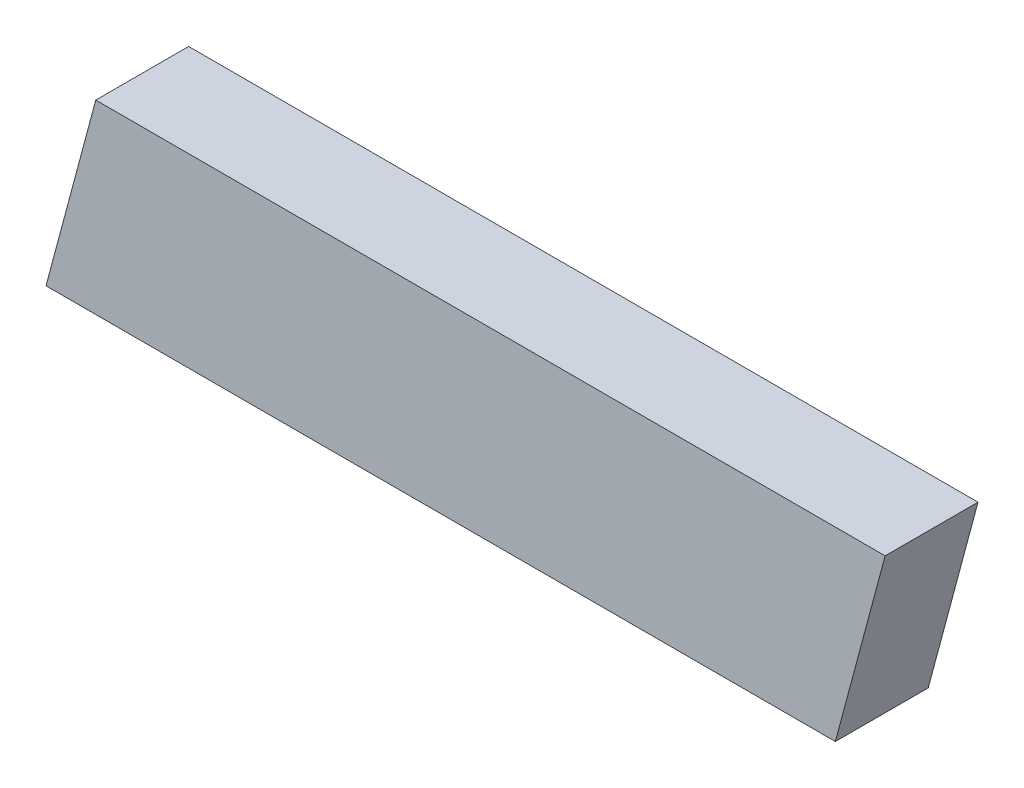
ISO-10303-21;
HEADER;
FILE_DESCRIPTION(('STEP AP214'),'2;1');
FILE_NAME('part.step','',(''),(''),'','','');
FILE_SCHEMA(('AUTOMOTIVE_DESIGN { 1 0 10303 214 1 1 1 1 }'));
ENDSEC;
DATA;
#1=APPLICATION_CONTEXT('core data for automotive mechanical design processes');
#2=APPLICATION_PROTOCOL_DEFINITION('international standard','automotive_design',2000,#1);
#3=PRODUCT_CONTEXT('',#1,'mechanical');
#4=PRODUCT('Part','Part','',(#3));
#5=PRODUCT_RELATED_PRODUCT_CATEGORY('part','',(#4));
#6=PRODUCT_DEFINITION_FORMATION('','',#4);
#7=PRODUCT_DEFINITION_CONTEXT('part definition',#1,'design');
#8=PRODUCT_DEFINITION('design','',#6,#7);
#9=PRODUCT_DEFINITION_SHAPE('','',#8);
#10=(LENGTH_UNIT() NAMED_UNIT(*) SI_UNIT(.MILLI.,.METRE.));
#11=(NAMED_UNIT(*) PLANE_ANGLE_UNIT() SI_UNIT($,.RADIAN.));
#12=(NAMED_UNIT(*) SI_UNIT($,.STERADIAN.) SOLID_ANGLE_UNIT());
#13=UNCERTAINTY_MEASURE_WITH_UNIT(LENGTH_MEASURE(1.E-05),#10,'distance_accuracy_value','');
#14=(GEOMETRIC_REPRESENTATION_CONTEXT(3) GLOBAL_UNCERTAINTY_ASSIGNED_CONTEXT((#13)) GLOBAL_UNIT_ASSIGNED_CONTEXT((#10,
#11,#12)) REPRESENTATION_CONTEXT('',''));
#15=CARTESIAN_POINT('',(0.,0.,0.));
#16=DIRECTION('',(0.,0.,1.));
#17=DIRECTION('',(1.,0.,0.));
#18=AXIS2_PLACEMENT_3D('',#15,#16,#17);
#19=CARTESIAN_POINT('',(0.,0.,50.8));
#20=DIRECTION('',(0.,1.,0.));
#21=DIRECTION('',(0.,0.,1.));
#22=AXIS2_PLACEMENT_3D('',#19,#20,#21);
#23=PLANE('',#22);
#24=DIRECTION('',(1.,0.,0.));
#25=VECTOR('',#24,1.);
#26=CARTESIAN_POINT('',(0.,0.,0.));
#27=LINE('',#26,#25);
#28=CARTESIAN_POINT('',(0.,0.,0.));
#29=VERTEX_POINT('',#28);
#30=CARTESIAN_POINT('',(431.8,0.,0.));
#31=VERTEX_POINT('',#30);
#32=EDGE_CURVE('E107',#29,#31,#27,.T.);
#33=ORIENTED_EDGE('',*,*,#32,.T.);
#34=DIRECTION('',(0.,0.,-1.));
#35=VECTOR('',#34,1.);
#36=CARTESIAN_POINT('',(431.8,0.,50.8));
#37=LINE('',#36,#35);
#38=CARTESIAN_POINT('',(431.8,0.,50.8));
#39=VERTEX_POINT('',#38);
#40=EDGE_CURVE('E11',#39,#31,#37,.T.);
#41=ORIENTED_EDGE('',*,*,#40,.F.);
#42=DIRECTION('',(1.,0.,0.));
#43=VECTOR('',#42,1.);
#44=CARTESIAN_POINT('',(0.,0.,50.8));
#45=LINE('',#44,#43);
#46=CARTESIAN_POINT('',(0.,0.,50.8));
#47=VERTEX_POINT('',#46);
#48=EDGE_CURVE('E91',#47,#39,#45,.T.);
#49=ORIENTED_EDGE('',*,*,#48,.F.);
#50=DIRECTION('',(0.,0.,-1.));
#51=VECTOR('',#50,1.);
#52=CARTESIAN_POINT('',(0.,0.,50.8));
#53=LINE('',#52,#51);
#54=EDGE_CURVE('E103',#47,#29,#53,.T.);
#55=ORIENTED_EDGE('',*,*,#54,.T.);
#56=EDGE_LOOP('',(#33,#41,#49,#55));
#57=FACE_BOUND('',#56,.T.);
#58=ADVANCED_FACE('F39',(#57),#23,.F.);
#59=CARTESIAN_POINT('',(431.8,0.,50.8));
#60=DIRECTION('',(-0.965925826289068,0.258819045102521,0.));
#61=DIRECTION('',(-0.258819045102521,-0.965925826289068,0.));
#62=AXIS2_PLACEMENT_3D('',#59,#60,#61);
#63=PLANE('',#62);
#64=DIRECTION('',(0.258819045102521,0.965925826289068,0.));
#65=VECTOR('',#64,1.);
#66=CARTESIAN_POINT('',(431.8,0.,0.));
#67=LINE('',#66,#65);
#68=CARTESIAN_POINT('',(459.023637951002,101.6,0.));
#69=VERTEX_POINT('',#68);
#70=EDGE_CURVE('E96',#31,#69,#67,.T.);
#71=ORIENTED_EDGE('',*,*,#70,.T.);
#72=DIRECTION('',(0.,0.,-1.));
#73=VECTOR('',#72,1.);
#74=CARTESIAN_POINT('',(459.023637951002,101.6,50.8));
#75=LINE('',#74,#73);
#76=CARTESIAN_POINT('',(459.023637951002,101.6,50.8));
#77=VERTEX_POINT('',#76);
#78=EDGE_CURVE('E48',#77,#69,#75,.T.);
#79=ORIENTED_EDGE('',*,*,#78,.F.);
#80=DIRECTION('',(0.258819045102521,0.965925826289068,0.));
#81=VECTOR('',#80,1.);
#82=CARTESIAN_POINT('',(431.8,0.,50.8));
#83=LINE('',#82,#81);
#84=EDGE_CURVE('E86',#39,#77,#83,.T.);
#85=ORIENTED_EDGE('',*,*,#84,.F.);
#86=ORIENTED_EDGE('',*,*,#40,.T.);
#87=EDGE_LOOP('',(#71,#79,#85,#86));
#88=FACE_BOUND('',#87,.T.);
#89=ADVANCED_FACE('F95',(#88),#63,.F.);
#90=CARTESIAN_POINT('',(27.2236379510021,101.6,50.8));
#91=DIRECTION('',(0.,-1.,0.));
#92=DIRECTION('',(0.,0.,-1.));
#93=AXIS2_PLACEMENT_3D('',#90,#91,#92);
#94=PLANE('',#93);
#95=DIRECTION('',(-1.,0.,0.));
#96=VECTOR('',#95,1.);
#97=CARTESIAN_POINT('',(27.2236379510021,101.6,0.));
#98=LINE('',#97,#96);
#99=CARTESIAN_POINT('',(27.2236379510021,101.6,0.));
#100=VERTEX_POINT('',#99);
#101=EDGE_CURVE('E73',#69,#100,#98,.T.);
#102=ORIENTED_EDGE('',*,*,#101,.T.);
#103=DIRECTION('',(0.,0.,-1.));
#104=VECTOR('',#103,1.);
#105=CARTESIAN_POINT('',(27.2236379510021,101.6,50.8));
#106=LINE('',#105,#104);
#107=CARTESIAN_POINT('',(27.2236379510021,101.6,50.8));
#108=VERTEX_POINT('',#107);
#109=EDGE_CURVE('E98',#108,#100,#106,.T.);
#110=ORIENTED_EDGE('',*,*,#109,.F.);
#111=DIRECTION('',(-1.,0.,0.));
#112=VECTOR('',#111,1.);
#113=CARTESIAN_POINT('',(27.2236379510021,101.6,50.8));
#114=LINE('',#113,#112);
#115=EDGE_CURVE('E89',#77,#108,#114,.T.);
#116=ORIENTED_EDGE('',*,*,#115,.F.);
#117=ORIENTED_EDGE('',*,*,#78,.T.);
#118=EDGE_LOOP('',(#102,#110,#116,#117));
#119=FACE_BOUND('',#118,.T.);
#120=ADVANCED_FACE('F99',(#119),#94,.F.);
#121=CARTESIAN_POINT('',(0.,0.,50.8));
#122=DIRECTION('',(0.965925826289068,-0.258819045102521,0.));
#123=DIRECTION('',(0.258819045102521,0.965925826289068,0.));
#124=AXIS2_PLACEMENT_3D('',#121,#122,#123);
#125=PLANE('',#124);
#126=DIRECTION('',(-0.258819045102522,-0.965925826289068,0.));
#127=VECTOR('',#126,1.);
#128=CARTESIAN_POINT('',(0.,0.,0.));
#129=LINE('',#128,#127);
#130=EDGE_CURVE('E79',#100,#29,#129,.T.);
#131=ORIENTED_EDGE('',*,*,#130,.T.);
#132=ORIENTED_EDGE('',*,*,#54,.F.);
#133=DIRECTION('',(-0.258819045102522,-0.965925826289068,0.));
#134=VECTOR('',#133,1.);
#135=CARTESIAN_POINT('',(0.,0.,50.8));
#136=LINE('',#135,#134);
#137=EDGE_CURVE('E56',#108,#47,#136,.T.);
#138=ORIENTED_EDGE('',*,*,#137,.F.);
#139=ORIENTED_EDGE('',*,*,#109,.T.);
#140=EDGE_LOOP('',(#131,#132,#138,#139));
#141=FACE_BOUND('',#140,.T.);
#142=ADVANCED_FACE('F120',(#141),#125,.F.);
#143=CARTESIAN_POINT('',(0.,0.,50.8));
#144=DIRECTION('',(0.,0.,1.));
#145=DIRECTION('',(1.,0.,0.));
#146=AXIS2_PLACEMENT_3D('',#143,#144,#145);
#147=PLANE('',#146);
#148=ORIENTED_EDGE('',*,*,#48,.T.);
#149=ORIENTED_EDGE('',*,*,#84,.T.);
#150=ORIENTED_EDGE('',*,*,#115,.T.);
#151=ORIENTED_EDGE('',*,*,#137,.T.);
#152=EDGE_LOOP('',(#148,#149,#150,#151));
#153=FACE_BOUND('',#152,.T.);
#154=ADVANCED_FACE('F87',(#153),#147,.T.);
#155=CARTESIAN_POINT('',(0.,0.,0.));
#156=DIRECTION('',(0.,0.,1.));
#157=DIRECTION('',(1.,0.,0.));
#158=AXIS2_PLACEMENT_3D('',#155,#156,#157);
#159=PLANE('',#158);
#160=ORIENTED_EDGE('',*,*,#32,.F.);
#161=ORIENTED_EDGE('',*,*,#130,.F.);
#162=ORIENTED_EDGE('',*,*,#101,.F.);
#163=ORIENTED_EDGE('',*,*,#70,.F.);
#164=EDGE_LOOP('',(#160,#161,#162,#163));
#165=FACE_BOUND('',#164,.T.);
#166=ADVANCED_FACE('F123',(#165),#159,.F.);
#167=CLOSED_SHELL('',(#58,#89,#120,#142,#154,#166));
#168=MANIFOLD_SOLID_BREP('B2',#167);
#169=ADVANCED_BREP_SHAPE_REPRESENTATION('',(#18,#168),#14);
#170=SHAPE_DEFINITION_REPRESENTATION(#9,#169);
ENDSEC;
END-ISO-10303-21;
